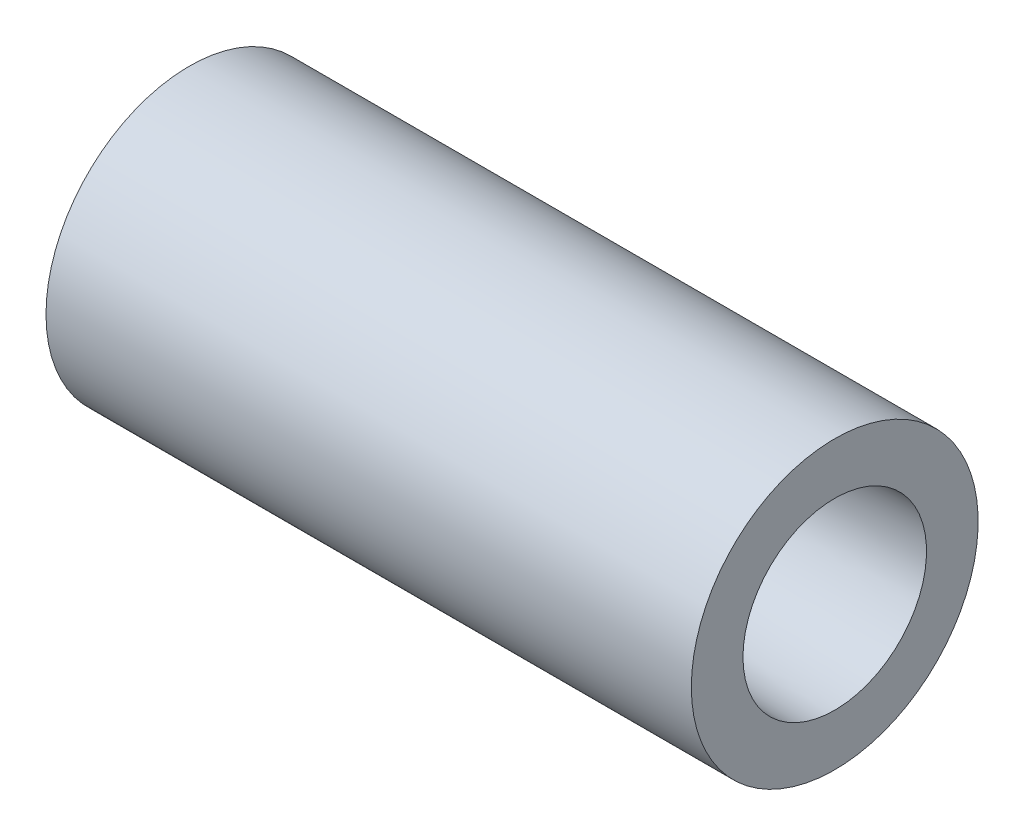
ISO-10303-21;
HEADER;
FILE_DESCRIPTION(('STEP AP214'),'2;1');
FILE_NAME('part.step','',(''),(''),'','','');
FILE_SCHEMA(('AUTOMOTIVE_DESIGN { 1 0 10303 214 1 1 1 1 }'));
ENDSEC;
DATA;
#1=APPLICATION_CONTEXT('core data for automotive mechanical design processes');
#2=APPLICATION_PROTOCOL_DEFINITION('international standard','automotive_design',2000,#1);
#3=PRODUCT_CONTEXT('',#1,'mechanical');
#4=PRODUCT('Part','Part','',(#3));
#5=PRODUCT_RELATED_PRODUCT_CATEGORY('part','',(#4));
#6=PRODUCT_DEFINITION_FORMATION('','',#4);
#7=PRODUCT_DEFINITION_CONTEXT('part definition',#1,'design');
#8=PRODUCT_DEFINITION('design','',#6,#7);
#9=PRODUCT_DEFINITION_SHAPE('','',#8);
#10=(LENGTH_UNIT() NAMED_UNIT(*) SI_UNIT(.MILLI.,.METRE.));
#11=(NAMED_UNIT(*) PLANE_ANGLE_UNIT() SI_UNIT($,.RADIAN.));
#12=(NAMED_UNIT(*) SI_UNIT($,.STERADIAN.) SOLID_ANGLE_UNIT());
#13=UNCERTAINTY_MEASURE_WITH_UNIT(LENGTH_MEASURE(1.E-05),#10,'distance_accuracy_value','');
#14=(GEOMETRIC_REPRESENTATION_CONTEXT(3) GLOBAL_UNCERTAINTY_ASSIGNED_CONTEXT((#13)) GLOBAL_UNIT_ASSIGNED_CONTEXT((#10,
#11,#12)) REPRESENTATION_CONTEXT('',''));
#15=CARTESIAN_POINT('',(0.,0.,0.));
#16=DIRECTION('',(0.,0.,1.));
#17=DIRECTION('',(1.,0.,0.));
#18=AXIS2_PLACEMENT_3D('',#15,#16,#17);
#19=CARTESIAN_POINT('',(45.,10.0000000000997,0.));
#20=DIRECTION('',(-1.,0.,0.));
#21=DIRECTION('',(0.,0.,1.));
#22=AXIS2_PLACEMENT_3D('',#19,#20,#21);
#23=PLANE('',#22);
#24=CARTESIAN_POINT('',(45.,0.,0.));
#25=DIRECTION('',(-1.,0.,0.));
#26=DIRECTION('',(0.,0.,1.));
#27=AXIS2_PLACEMENT_3D('',#24,#25,#26);
#28=CIRCLE('',#27,10.0000000000997);
#29=CARTESIAN_POINT('',(45.,0.,10.0000000000997));
#30=VERTEX_POINT('',#29);
#31=EDGE_CURVE('E63',#30,#30,#28,.T.);
#32=ORIENTED_EDGE('',*,*,#31,.F.);
#33=EDGE_LOOP('',(#32));
#34=FACE_BOUND('',#33,.T.);
#35=CARTESIAN_POINT('',(45.,0.,0.));
#36=DIRECTION('',(-1.,0.,0.));
#37=DIRECTION('',(0.,0.,1.));
#38=AXIS2_PLACEMENT_3D('',#35,#36,#37);
#39=CIRCLE('',#38,6.4);
#40=CARTESIAN_POINT('',(45.,0.,6.4));
#41=VERTEX_POINT('',#40);
#42=EDGE_CURVE('E10',#41,#41,#39,.T.);
#43=ORIENTED_EDGE('',*,*,#42,.T.);
#44=EDGE_LOOP('',(#43));
#45=FACE_BOUND('',#44,.T.);
#46=ADVANCED_FACE('F35',(#34,#45),#23,.F.);
#47=CARTESIAN_POINT('',(28.0000000000019,5.00000000000024,0.));
#48=CARTESIAN_POINT('',(29.0580936902289,5.13404078663894,0.));
#49=CARTESIAN_POINT('',(30.1158874906169,5.27042797680579,0.));
#50=CARTESIAN_POINT('',(31.1668669557,5.40593655712944,0.));
#51=CARTESIAN_POINT('',(32.2339446412822,5.52671835408825,0.));
#52=CARTESIAN_POINT('',(34.1571480094945,5.74440443436942,0.));
#53=CARTESIAN_POINT('',(36.4803195115435,5.94132975198152,0.));
#54=CARTESIAN_POINT('',(38.7620553085113,6.13474274199471,0.));
#55=CARTESIAN_POINT('',(40.736247962394,6.24237111452227,0.));
#56=CARTESIAN_POINT('',(42.8662614950623,6.35849447742298,0.));
#57=CARTESIAN_POINT('',(45.,6.4,0.));
#58=B_SPLINE_CURVE_WITH_KNOTS('',2,(#47,#48,#49,#50,#51,#52,#53,#54,#55,#56,#57),.UNSPECIFIED.,
.F.,.F.,(3,2,2,2,2,3),(0.,0.125,0.25,0.5,0.75,1.),.UNSPECIFIED.);
#59=CARTESIAN_POINT('',(0.,0.,0.));
#60=DIRECTION('',(-1.,0.,0.));
#61=AXIS1_PLACEMENT('',#59,#60);
#62=SURFACE_OF_REVOLUTION('',#58,#61);
#63=ORIENTED_EDGE('',*,*,#42,.F.);
#64=EDGE_LOOP('',(#63));
#65=FACE_BOUND('',#64,.T.);
#66=CARTESIAN_POINT('',(28.0000000000019,0.,0.));
#67=DIRECTION('',(-1.,0.,0.));
#68=DIRECTION('',(0.,0.,1.));
#69=AXIS2_PLACEMENT_3D('',#66,#67,#68);
#70=CIRCLE('',#69,5.00000000000024);
#71=CARTESIAN_POINT('',(28.0000000000019,0.,5.00000000000024));
#72=VERTEX_POINT('',#71);
#73=EDGE_CURVE('E41',#72,#72,#70,.T.);
#74=ORIENTED_EDGE('',*,*,#73,.T.);
#75=EDGE_LOOP('',(#74));
#76=FACE_BOUND('',#75,.T.);
#77=ADVANCED_FACE('F77',(#65,#76),#62,.T.);
#78=CARTESIAN_POINT('',(17.0000000010735,3.60000000020997,0.));
#79=CARTESIAN_POINT('',(17.6085940023,3.71904360352924,0.));
#80=CARTESIAN_POINT('',(18.3792642263802,3.81688108500664,0.));
#81=CARTESIAN_POINT('',(18.6742846345152,3.85433426902036,0.));
#82=CARTESIAN_POINT('',(19.0643557602307,3.89779896187801,0.));
#83=CARTESIAN_POINT('',(19.1268939415617,3.9047674418916,0.));
#84=CARTESIAN_POINT('',(19.7486981585024,3.97241146508142,0.));
#85=CARTESIAN_POINT('',(20.8369754452692,4.09080154996247,0.));
#86=CARTESIAN_POINT('',(22.4963715286627,4.30537236165537,0.));
#87=CARTESIAN_POINT('',(23.1850365869493,4.39442127651053,0.));
#88=CARTESIAN_POINT('',(23.8736598320857,4.48379296106247,0.));
#89=CARTESIAN_POINT('',(24.3249171676164,4.54235855339129,0.));
#90=CARTESIAN_POINT('',(25.2500297487897,4.65760486321701,0.));
#91=CARTESIAN_POINT('',(25.3235673760509,4.66676584572624,0.));
#92=CARTESIAN_POINT('',(26.6253020668228,4.82811419759775,0.));
#93=CARTESIAN_POINT('',(27.4533743714989,4.93075270184681,0.));
#94=CARTESIAN_POINT('',(28.0000000000019,5.00000000000024,0.));
#95=B_SPLINE_CURVE_WITH_KNOTS('',2,(#78,#79,#80,#81,#82,#83,#84,#85,#86,#87,#88,#89,#90,#91,#92,
#93,#94),.UNSPECIFIED.,.F.,.F.,(3,2,2,2,2,2,2,2,3),(0.,0.125,0.1875,0.25,0.5,0.625,0.75,0.875,
1.),.UNSPECIFIED.);
#96=CARTESIAN_POINT('',(0.,0.,0.));
#97=DIRECTION('',(-1.,0.,0.));
#98=AXIS1_PLACEMENT('',#96,#97);
#99=SURFACE_OF_REVOLUTION('',#95,#98);
#100=ORIENTED_EDGE('',*,*,#73,.F.);
#101=EDGE_LOOP('',(#100));
#102=FACE_BOUND('',#101,.T.);
#103=CARTESIAN_POINT('',(17.0000000010735,0.,0.));
#104=DIRECTION('',(-1.,0.,0.));
#105=DIRECTION('',(0.,0.,1.));
#106=AXIS2_PLACEMENT_3D('',#103,#104,#105);
#107=CIRCLE('',#106,3.60000000020997);
#108=CARTESIAN_POINT('',(17.0000000010735,0.,3.60000000020997));
#109=VERTEX_POINT('',#108);
#110=EDGE_CURVE('E45',#109,#109,#107,.T.);
#111=ORIENTED_EDGE('',*,*,#110,.T.);
#112=EDGE_LOOP('',(#111));
#113=FACE_BOUND('',#112,.T.);
#114=ADVANCED_FACE('F80',(#102,#113),#99,.T.);
#115=CARTESIAN_POINT('',(13.9999999994398,3.70000000018253,0.));
#116=CARTESIAN_POINT('',(14.0256874597031,3.69162997812796,0.));
#117=CARTESIAN_POINT('',(14.3648253727215,3.5754671669674,0.));
#118=CARTESIAN_POINT('',(14.583988304535,3.50039864385517,0.));
#119=CARTESIAN_POINT('',(14.7296819301834,3.46061958226849,0.));
#120=CARTESIAN_POINT('',(14.925217423634,3.40723208228879,0.));
#121=CARTESIAN_POINT('',(15.0983109391781,3.38561262411862,0.));
#122=CARTESIAN_POINT('',(15.2753732244488,3.36349746481939,0.));
#123=CARTESIAN_POINT('',(15.4727176082283,3.36628616005492,0.));
#124=CARTESIAN_POINT('',(15.7938394441084,3.37082396810697,0.));
#125=CARTESIAN_POINT('',(16.2335929538758,3.44843018059419,0.));
#126=CARTESIAN_POINT('',(16.3832500621539,3.47484116103501,0.));
#127=CARTESIAN_POINT('',(16.6168963379194,3.52240962545345,0.));
#128=CARTESIAN_POINT('',(16.9491220595143,3.59004805608881,0.));
#129=CARTESIAN_POINT('',(17.0000000010735,3.60000000020997,0.));
#130=B_SPLINE_CURVE_WITH_KNOTS('',2,(#115,#116,#117,#118,#119,#120,#121,#122,#123,#124,#125,
#126,#127,#128,#129),.UNSPECIFIED.,.F.,.F.,(3,2,2,2,2,2,2,3),(0.,0.125,0.25,0.375,0.5,0.75,
0.875,1.),.UNSPECIFIED.);
#131=CARTESIAN_POINT('',(0.,0.,0.));
#132=DIRECTION('',(-1.,0.,0.));
#133=AXIS1_PLACEMENT('',#131,#132);
#134=SURFACE_OF_REVOLUTION('',#130,#133);
#135=ORIENTED_EDGE('',*,*,#110,.F.);
#136=EDGE_LOOP('',(#135));
#137=FACE_BOUND('',#136,.T.);
#138=CARTESIAN_POINT('',(13.9999999994398,0.,0.));
#139=DIRECTION('',(-1.,0.,0.));
#140=DIRECTION('',(0.,0.,1.));
#141=AXIS2_PLACEMENT_3D('',#138,#139,#140);
#142=CIRCLE('',#141,3.70000000018253);
#143=CARTESIAN_POINT('',(13.9999999994398,0.,3.70000000018253));
#144=VERTEX_POINT('',#143);
#145=EDGE_CURVE('E49',#144,#144,#142,.T.);
#146=ORIENTED_EDGE('',*,*,#145,.T.);
#147=EDGE_LOOP('',(#146));
#148=FACE_BOUND('',#147,.T.);
#149=ADVANCED_FACE('F84',(#137,#148),#134,.T.);
#150=CARTESIAN_POINT('',(3.9999999985771,6.00000000009967,0.));
#151=CARTESIAN_POINT('',(4.5415931826985,5.96206421209799,0.));
#152=CARTESIAN_POINT('',(5.27249985549,5.83478897703097,0.));
#153=CARTESIAN_POINT('',(5.62205918914015,5.77391903560564,0.));
#154=CARTESIAN_POINT('',(6.5367099022242,5.59691979224536,0.));
#155=CARTESIAN_POINT('',(7.2679037789784,5.45542232104266,0.));
#156=CARTESIAN_POINT('',(7.79519054587372,5.34381874066026,0.));
#157=CARTESIAN_POINT('',(8.48343136358928,5.19814821705765,0.));
#158=CARTESIAN_POINT('',(9.04685849822136,5.05772416747529,0.));
#159=CARTESIAN_POINT('',(9.67812987694576,4.90039116390278,0.));
#160=CARTESIAN_POINT('',(10.2848639985799,4.71429586448721,0.));
#161=CARTESIAN_POINT('',(10.3904332284348,4.6819160514218,0.));
#162=CARTESIAN_POINT('',(10.8983591611851,4.52250018766667,0.));
#163=CARTESIAN_POINT('',(11.2728891491941,4.40495151040708,0.));
#164=CARTESIAN_POINT('',(11.5124068280529,4.3347764541108,0.));
#165=CARTESIAN_POINT('',(11.8406015751646,4.23862035839197,0.));
#166=CARTESIAN_POINT('',(12.1309310179722,4.16705631074673,0.));
#167=CARTESIAN_POINT('',(12.3267254720354,4.11879443450107,0.));
#168=CARTESIAN_POINT('',(12.7550787470114,4.02243064875108,0.));
#169=CARTESIAN_POINT('',(13.1625769497279,3.93075848982507,0.));
#170=CARTESIAN_POINT('',(13.3799852234296,3.87619198692826,0.));
#171=CARTESIAN_POINT('',(13.7251097712927,3.78957044617415,0.));
#172=CARTESIAN_POINT('',(13.9999999994398,3.70000000018253,0.));
#173=B_SPLINE_CURVE_WITH_KNOTS('',2,(#150,#151,#152,#153,#154,#155,#156,#157,#158,#159,#160,
#161,#162,#163,#164,#165,#166,#167,#168,#169,#170,#171,#172),.UNSPECIFIED.,.F.,.F.,(3,2,2,2,2,2,
2,2,2,2,2,3),(0.,0.125,0.25,0.375,0.5,0.625,0.6875,0.75,0.8125,0.875,0.9375,1.),.UNSPECIFIED.);
#174=CARTESIAN_POINT('',(0.,0.,0.));
#175=DIRECTION('',(-1.,0.,0.));
#176=AXIS1_PLACEMENT('',#174,#175);
#177=SURFACE_OF_REVOLUTION('',#173,#176);
#178=ORIENTED_EDGE('',*,*,#145,.F.);
#179=EDGE_LOOP('',(#178));
#180=FACE_BOUND('',#179,.T.);
#181=CARTESIAN_POINT('',(3.9999999985771,0.,0.));
#182=DIRECTION('',(-1.,0.,0.));
#183=DIRECTION('',(0.,0.,1.));
#184=AXIS2_PLACEMENT_3D('',#181,#182,#183);
#185=CIRCLE('',#184,6.00000000009967);
#186=CARTESIAN_POINT('',(3.9999999985771,0.,6.00000000009967));
#187=VERTEX_POINT('',#186);
#188=EDGE_CURVE('E54',#187,#187,#185,.T.);
#189=ORIENTED_EDGE('',*,*,#188,.T.);
#190=EDGE_LOOP('',(#189));
#191=FACE_BOUND('',#190,.T.);
#192=ADVANCED_FACE('F88',(#180,#191),#177,.T.);
#193=CARTESIAN_POINT('',(0.,6.00000000009967,0.));
#194=CARTESIAN_POINT('',(0.998511657135045,5.97675793985448,0.));
#195=CARTESIAN_POINT('',(1.99999999977929,6.00000000004471,0.));
#196=CARTESIAN_POINT('',(2.25040505243035,6.00581128017434,0.));
#197=CARTESIAN_POINT('',(2.50077217735323,6.01307517224579,0.));
#198=CARTESIAN_POINT('',(2.75065844925409,6.02032511334644,0.));
#199=CARTESIAN_POINT('',(3.00145147183688,6.02324291847849,0.));
#200=CARTESIAN_POINT('',(3.57320368294465,6.02989486404958,0.));
#201=CARTESIAN_POINT('',(3.9999999985771,6.00000000009967,0.));
#202=B_SPLINE_CURVE_WITH_KNOTS('',2,(#193,#194,#195,#196,#197,#198,#199,#200,#201),
.UNSPECIFIED.,.F.,.F.,(3,2,2,2,3),(0.,0.5,0.625,0.75,1.),.UNSPECIFIED.);
#203=CARTESIAN_POINT('',(0.,0.,0.));
#204=DIRECTION('',(-1.,0.,0.));
#205=AXIS1_PLACEMENT('',#203,#204);
#206=SURFACE_OF_REVOLUTION('',#202,#205);
#207=ORIENTED_EDGE('',*,*,#188,.F.);
#208=EDGE_LOOP('',(#207));
#209=FACE_BOUND('',#208,.T.);
#210=CARTESIAN_POINT('',(0.,0.,0.));
#211=DIRECTION('',(-1.,0.,0.));
#212=DIRECTION('',(0.,0.,1.));
#213=AXIS2_PLACEMENT_3D('',#210,#211,#212);
#214=CIRCLE('',#213,6.00000000009967);
#215=CARTESIAN_POINT('',(0.,0.,6.00000000009967));
#216=VERTEX_POINT('',#215);
#217=EDGE_CURVE('E57',#216,#216,#214,.T.);
#218=ORIENTED_EDGE('',*,*,#217,.T.);
#219=EDGE_LOOP('',(#218));
#220=FACE_BOUND('',#219,.T.);
#221=ADVANCED_FACE('F111',(#209,#220),#206,.T.);
#222=CARTESIAN_POINT('',(0.,10.0000000000997,0.));
#223=DIRECTION('',(1.,0.,0.));
#224=DIRECTION('',(0.,0.,-1.));
#225=AXIS2_PLACEMENT_3D('',#222,#223,#224);
#226=PLANE('',#225);
#227=ORIENTED_EDGE('',*,*,#217,.F.);
#228=EDGE_LOOP('',(#227));
#229=FACE_BOUND('',#228,.T.);
#230=CARTESIAN_POINT('',(0.,0.,0.));
#231=DIRECTION('',(-1.,0.,0.));
#232=DIRECTION('',(0.,0.,1.));
#233=AXIS2_PLACEMENT_3D('',#230,#231,#232);
#234=CIRCLE('',#233,10.0000000000997);
#235=CARTESIAN_POINT('',(0.,0.,10.0000000000997));
#236=VERTEX_POINT('',#235);
#237=EDGE_CURVE('E60',#236,#236,#234,.T.);
#238=ORIENTED_EDGE('',*,*,#237,.T.);
#239=EDGE_LOOP('',(#238));
#240=FACE_BOUND('',#239,.T.);
#241=ADVANCED_FACE('F114',(#229,#240),#226,.F.);
#242=CARTESIAN_POINT('',(0.,0.,0.));
#243=DIRECTION('',(-1.,0.,0.));
#244=DIRECTION('',(0.,0.,1.));
#245=AXIS2_PLACEMENT_3D('',#242,#243,#244);
#246=CYLINDRICAL_SURFACE('',#245,10.0000000000997);
#247=ORIENTED_EDGE('',*,*,#237,.F.);
#248=EDGE_LOOP('',(#247));
#249=FACE_BOUND('',#248,.T.);
#250=ORIENTED_EDGE('',*,*,#31,.T.);
#251=EDGE_LOOP('',(#250));
#252=FACE_BOUND('',#251,.T.);
#253=ADVANCED_FACE('F118',(#249,#252),#246,.T.);
#254=CLOSED_SHELL('',(#46,#77,#114,#149,#192,#221,#241,#253));
#255=MANIFOLD_SOLID_BREP('B2',#254);
#256=ADVANCED_BREP_SHAPE_REPRESENTATION('',(#18,#255),#14);
#257=SHAPE_DEFINITION_REPRESENTATION(#9,#256);
ENDSEC;
END-ISO-10303-21;
